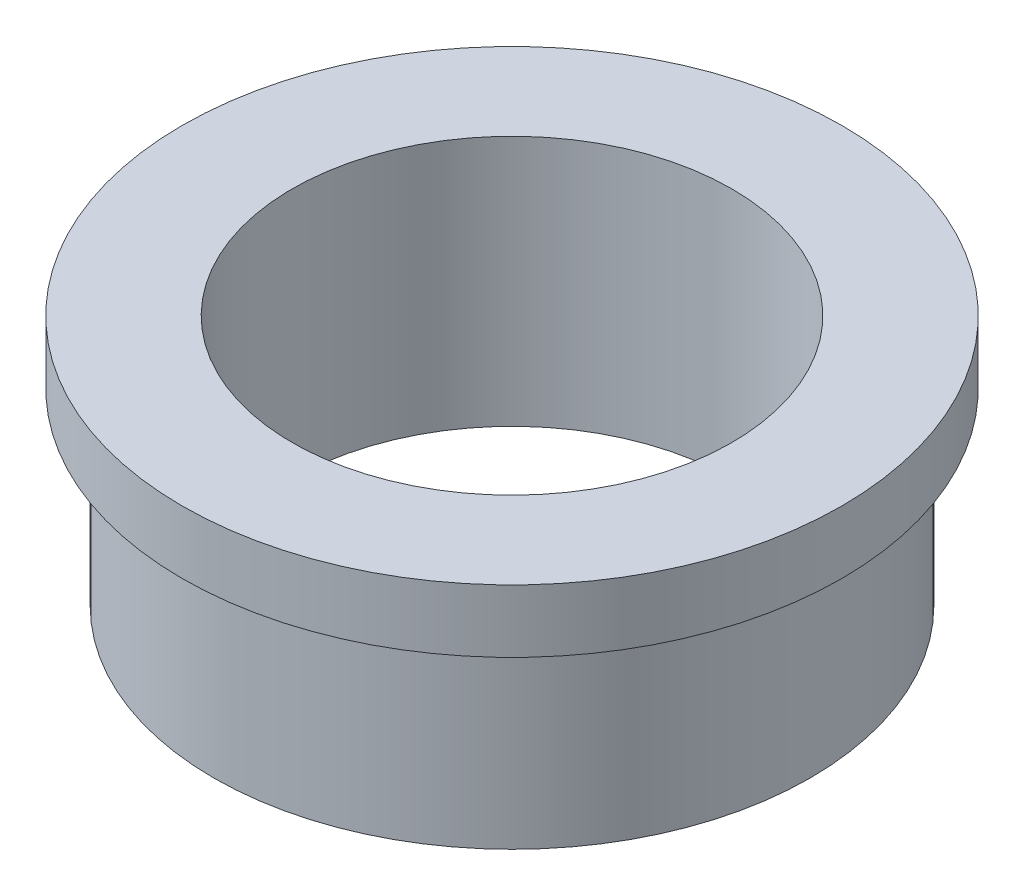
ISO-10303-21;
HEADER;
FILE_DESCRIPTION(('STEP AP214'),'2;1');
FILE_NAME('part.step','',(''),(''),'','','');
FILE_SCHEMA(('AUTOMOTIVE_DESIGN { 1 0 10303 214 1 1 1 1 }'));
ENDSEC;
DATA;
#1=APPLICATION_CONTEXT('core data for automotive mechanical design processes');
#2=APPLICATION_PROTOCOL_DEFINITION('international standard','automotive_design',2000,#1);
#3=PRODUCT_CONTEXT('',#1,'mechanical');
#4=PRODUCT('Part','Part','',(#3));
#5=PRODUCT_RELATED_PRODUCT_CATEGORY('part','',(#4));
#6=PRODUCT_DEFINITION_FORMATION('','',#4);
#7=PRODUCT_DEFINITION_CONTEXT('part definition',#1,'design');
#8=PRODUCT_DEFINITION('design','',#6,#7);
#9=PRODUCT_DEFINITION_SHAPE('','',#8);
#10=(LENGTH_UNIT() NAMED_UNIT(*) SI_UNIT(.MILLI.,.METRE.));
#11=(NAMED_UNIT(*) PLANE_ANGLE_UNIT() SI_UNIT($,.RADIAN.));
#12=(NAMED_UNIT(*) SI_UNIT($,.STERADIAN.) SOLID_ANGLE_UNIT());
#13=UNCERTAINTY_MEASURE_WITH_UNIT(LENGTH_MEASURE(1.E-05),#10,'distance_accuracy_value','');
#14=(GEOMETRIC_REPRESENTATION_CONTEXT(3) GLOBAL_UNCERTAINTY_ASSIGNED_CONTEXT((#13)) GLOBAL_UNIT_ASSIGNED_CONTEXT((#10,
#11,#12)) REPRESENTATION_CONTEXT('',''));
#15=CARTESIAN_POINT('',(0.,0.,0.));
#16=DIRECTION('',(0.,0.,1.));
#17=DIRECTION('',(1.,0.,0.));
#18=AXIS2_PLACEMENT_3D('',#15,#16,#17);
#19=CARTESIAN_POINT('',(0.,0.,0.));
#20=DIRECTION('',(0.,-1.,0.));
#21=DIRECTION('',(0.,0.,-1.));
#22=AXIS2_PLACEMENT_3D('',#19,#20,#21);
#23=CYLINDRICAL_SURFACE('',#22,7.);
#24=CARTESIAN_POINT('',(0.,8.,0.));
#25=DIRECTION('',(0.,-1.,0.));
#26=DIRECTION('',(0.,0.,-1.));
#27=AXIS2_PLACEMENT_3D('',#24,#25,#26);
#28=CIRCLE('',#27,7.);
#29=CARTESIAN_POINT('',(0.,8.,-7.));
#30=VERTEX_POINT('',#29);
#31=EDGE_CURVE('E10',#30,#30,#28,.T.);
#32=ORIENTED_EDGE('',*,*,#31,.F.);
#33=EDGE_LOOP('',(#32));
#34=FACE_BOUND('',#33,.T.);
#35=CARTESIAN_POINT('',(0.,0.,0.));
#36=DIRECTION('',(0.,-1.,0.));
#37=DIRECTION('',(0.,0.,-1.));
#38=AXIS2_PLACEMENT_3D('',#35,#36,#37);
#39=CIRCLE('',#38,7.);
#40=CARTESIAN_POINT('',(0.,0.,-7.));
#41=VERTEX_POINT('',#40);
#42=EDGE_CURVE('E52',#41,#41,#39,.T.);
#43=ORIENTED_EDGE('',*,*,#42,.T.);
#44=EDGE_LOOP('',(#43));
#45=FACE_BOUND('',#44,.T.);
#46=ADVANCED_FACE('F30',(#34,#45),#23,.F.);
#47=CARTESIAN_POINT('',(-7.,8.,0.));
#48=DIRECTION('',(0.,-1.,0.));
#49=DIRECTION('',(0.,0.,-1.));
#50=AXIS2_PLACEMENT_3D('',#47,#48,#49);
#51=PLANE('',#50);
#52=CARTESIAN_POINT('',(0.,8.,0.));
#53=DIRECTION('',(0.,-1.,0.));
#54=DIRECTION('',(0.,0.,-1.));
#55=AXIS2_PLACEMENT_3D('',#52,#53,#54);
#56=CIRCLE('',#55,10.5);
#57=CARTESIAN_POINT('',(0.,8.,-10.5));
#58=VERTEX_POINT('',#57);
#59=EDGE_CURVE('E36',#58,#58,#56,.T.);
#60=ORIENTED_EDGE('',*,*,#59,.F.);
#61=EDGE_LOOP('',(#60));
#62=FACE_BOUND('',#61,.T.);
#63=ORIENTED_EDGE('',*,*,#31,.T.);
#64=EDGE_LOOP('',(#63));
#65=FACE_BOUND('',#64,.T.);
#66=ADVANCED_FACE('F77',(#62,#65),#51,.F.);
#67=CARTESIAN_POINT('',(0.,0.,0.));
#68=DIRECTION('',(0.,-1.,0.));
#69=DIRECTION('',(0.,0.,-1.));
#70=AXIS2_PLACEMENT_3D('',#67,#68,#69);
#71=CYLINDRICAL_SURFACE('',#70,10.5);
#72=CARTESIAN_POINT('',(0.,6.,0.));
#73=DIRECTION('',(0.,-1.,0.));
#74=DIRECTION('',(0.,0.,-1.));
#75=AXIS2_PLACEMENT_3D('',#72,#73,#74);
#76=CIRCLE('',#75,10.5);
#77=CARTESIAN_POINT('',(0.,6.,-10.5));
#78=VERTEX_POINT('',#77);
#79=EDGE_CURVE('E40',#78,#78,#76,.T.);
#80=ORIENTED_EDGE('',*,*,#79,.F.);
#81=EDGE_LOOP('',(#80));
#82=FACE_BOUND('',#81,.T.);
#83=ORIENTED_EDGE('',*,*,#59,.T.);
#84=EDGE_LOOP('',(#83));
#85=FACE_BOUND('',#84,.T.);
#86=ADVANCED_FACE('F72',(#82,#85),#71,.T.);
#87=CARTESIAN_POINT('',(-10.5,6.,0.));
#88=DIRECTION('',(0.,1.,0.));
#89=DIRECTION('',(0.,0.,1.));
#90=AXIS2_PLACEMENT_3D('',#87,#88,#89);
#91=PLANE('',#90);
#92=CARTESIAN_POINT('',(0.,6.,0.));
#93=DIRECTION('',(0.,-1.,0.));
#94=DIRECTION('',(0.,0.,-1.));
#95=AXIS2_PLACEMENT_3D('',#92,#93,#94);
#96=CIRCLE('',#95,9.5);
#97=CARTESIAN_POINT('',(0.,6.,-9.5));
#98=VERTEX_POINT('',#97);
#99=EDGE_CURVE('E44',#98,#98,#96,.T.);
#100=ORIENTED_EDGE('',*,*,#99,.F.);
#101=EDGE_LOOP('',(#100));
#102=FACE_BOUND('',#101,.T.);
#103=ORIENTED_EDGE('',*,*,#79,.T.);
#104=EDGE_LOOP('',(#103));
#105=FACE_BOUND('',#104,.T.);
#106=ADVANCED_FACE('F66',(#102,#105),#91,.F.);
#107=CARTESIAN_POINT('',(0.,0.,0.));
#108=DIRECTION('',(0.,-1.,0.));
#109=DIRECTION('',(0.,0.,-1.));
#110=AXIS2_PLACEMENT_3D('',#107,#108,#109);
#111=CYLINDRICAL_SURFACE('',#110,9.5);
#112=CARTESIAN_POINT('',(0.,0.,0.));
#113=DIRECTION('',(0.,-1.,0.));
#114=DIRECTION('',(0.,0.,-1.));
#115=AXIS2_PLACEMENT_3D('',#112,#113,#114);
#116=CIRCLE('',#115,9.5);
#117=CARTESIAN_POINT('',(0.,0.,-9.5));
#118=VERTEX_POINT('',#117);
#119=EDGE_CURVE('E49',#118,#118,#116,.T.);
#120=ORIENTED_EDGE('',*,*,#119,.F.);
#121=EDGE_LOOP('',(#120));
#122=FACE_BOUND('',#121,.T.);
#123=ORIENTED_EDGE('',*,*,#99,.T.);
#124=EDGE_LOOP('',(#123));
#125=FACE_BOUND('',#124,.T.);
#126=ADVANCED_FACE('F60',(#122,#125),#111,.T.);
#127=CARTESIAN_POINT('',(-7.,0.,0.));
#128=DIRECTION('',(0.,1.,0.));
#129=DIRECTION('',(0.,0.,1.));
#130=AXIS2_PLACEMENT_3D('',#127,#128,#129);
#131=PLANE('',#130);
#132=ORIENTED_EDGE('',*,*,#42,.F.);
#133=EDGE_LOOP('',(#132));
#134=FACE_BOUND('',#133,.T.);
#135=ORIENTED_EDGE('',*,*,#119,.T.);
#136=EDGE_LOOP('',(#135));
#137=FACE_BOUND('',#136,.T.);
#138=ADVANCED_FACE('F57',(#134,#137),#131,.F.);
#139=CLOSED_SHELL('',(#46,#66,#86,#106,#126,#138));
#140=MANIFOLD_SOLID_BREP('B2',#139);
#141=ADVANCED_BREP_SHAPE_REPRESENTATION('',(#18,#140),#14);
#142=SHAPE_DEFINITION_REPRESENTATION(#9,#141);
ENDSEC;
END-ISO-10303-21;
